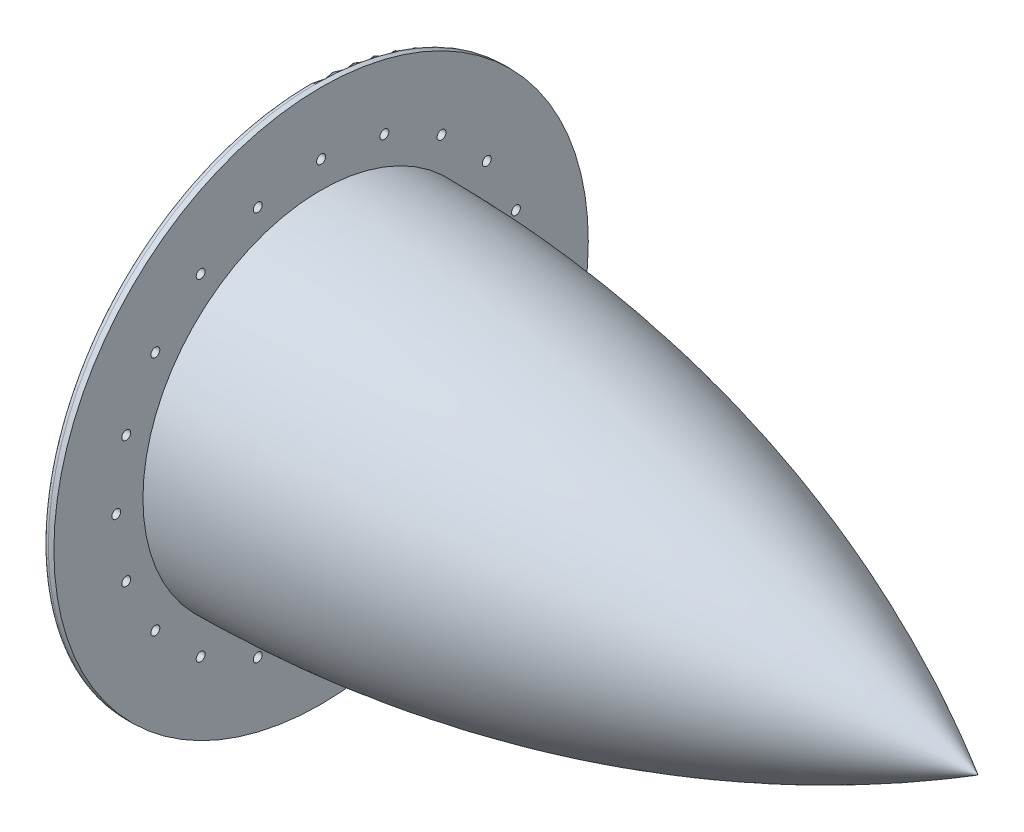
ISO-10303-21;
HEADER;
FILE_DESCRIPTION(('STEP AP214'),'2;1');
FILE_NAME('part.step','',(''),(''),'','','');
FILE_SCHEMA(('AUTOMOTIVE_DESIGN { 1 0 10303 214 1 1 1 1 }'));
ENDSEC;
DATA;
#1=APPLICATION_CONTEXT('core data for automotive mechanical design processes');
#2=APPLICATION_PROTOCOL_DEFINITION('international standard','automotive_design',2000,#1);
#3=PRODUCT_CONTEXT('',#1,'mechanical');
#4=PRODUCT('Part','Part','',(#3));
#5=PRODUCT_RELATED_PRODUCT_CATEGORY('part','',(#4));
#6=PRODUCT_DEFINITION_FORMATION('','',#4);
#7=PRODUCT_DEFINITION_CONTEXT('part definition',#1,'design');
#8=PRODUCT_DEFINITION('design','',#6,#7);
#9=PRODUCT_DEFINITION_SHAPE('','',#8);
#10=(LENGTH_UNIT() NAMED_UNIT(*) SI_UNIT(.MILLI.,.METRE.));
#11=(NAMED_UNIT(*) PLANE_ANGLE_UNIT() SI_UNIT($,.RADIAN.));
#12=(NAMED_UNIT(*) SI_UNIT($,.STERADIAN.) SOLID_ANGLE_UNIT());
#13=UNCERTAINTY_MEASURE_WITH_UNIT(LENGTH_MEASURE(1.E-05),#10,'distance_accuracy_value','');
#14=(GEOMETRIC_REPRESENTATION_CONTEXT(3) GLOBAL_UNCERTAINTY_ASSIGNED_CONTEXT((#13)) GLOBAL_UNIT_ASSIGNED_CONTEXT((#10,
#11,#12)) REPRESENTATION_CONTEXT('',''));
#15=CARTESIAN_POINT('',(0.,0.,0.));
#16=DIRECTION('',(0.,0.,1.));
#17=DIRECTION('',(1.,0.,0.));
#18=AXIS2_PLACEMENT_3D('',#15,#16,#17);
#19=CARTESIAN_POINT('',(-105.546398013908,0.,-513.894715566413));
#20=DIRECTION('',(0.,-1.,0.));
#21=DIRECTION('',(0.,0.,1.));
#22=AXIS2_PLACEMENT_3D('',#19,#20,#21);
#23=CIRCLE('',#22,593.899148863612);
#24=TRIMMED_CURVE('',#23,(PARAMETER_VALUE(-0.525068652014968)),
(PARAMETER_VALUE(0.525068652014968)),.T.,.PARAMETER.);
#25=CARTESIAN_POINT('',(-105.546398013908,0.,0.));
#26=DIRECTION('',(-1.,0.,0.));
#27=AXIS1_PLACEMENT('',#25,#26);
#28=SURFACE_OF_REVOLUTION('',#24,#27);
#29=CARTESIAN_POINT('',(192.158859470469,0.,0.));
#30=VERTEX_POINT('',#29);
#31=VERTEX_LOOP('',#30);
#32=FACE_BOUND('',#31,.T.);
#33=CARTESIAN_POINT('',(-102.841140529532,0.,0.));
#34=DIRECTION('',(-1.,0.,0.));
#35=DIRECTION('',(0.,0.,1.));
#36=AXIS2_PLACEMENT_3D('',#33,#34,#35);
#37=CIRCLE('',#36,79.9982719345903);
#38=CARTESIAN_POINT('',(-102.841140529532,0.,79.9982719345903));
#39=VERTEX_POINT('',#38);
#40=EDGE_CURVE('E67',#39,#39,#37,.T.);
#41=ORIENTED_EDGE('',*,*,#40,.F.);
#42=EDGE_LOOP('',(#41));
#43=FACE_BOUND('',#42,.T.);
#44=ADVANCED_FACE('F39',(#32,#43),#28,.T.);
#45=CARTESIAN_POINT('',(-102.841140529532,0.,0.));
#46=DIRECTION('',(-1.,0.,0.));
#47=DIRECTION('',(0.,0.,1.));
#48=AXIS2_PLACEMENT_3D('',#45,#46,#47);
#49=CYLINDRICAL_SURFACE('',#48,120.);
#50=CARTESIAN_POINT('',(-105.341140529532,0.,0.));
#51=DIRECTION('',(1.,0.,0.));
#52=DIRECTION('',(0.,0.,-1.));
#53=AXIS2_PLACEMENT_3D('',#50,#51,#52);
#54=CIRCLE('',#53,120.);
#55=CARTESIAN_POINT('',(-105.341140529532,0.,-120.));
#56=VERTEX_POINT('',#55);
#57=EDGE_CURVE('E11',#56,#56,#54,.T.);
#58=ORIENTED_EDGE('',*,*,#57,.T.);
#59=EDGE_LOOP('',(#58));
#60=FACE_BOUND('',#59,.T.);
#61=CARTESIAN_POINT('',(-102.841140529532,0.,0.));
#62=DIRECTION('',(-1.,0.,0.));
#63=DIRECTION('',(0.,0.,1.));
#64=AXIS2_PLACEMENT_3D('',#61,#62,#63);
#65=CIRCLE('',#64,120.);
#66=CARTESIAN_POINT('',(-102.841140529532,0.,120.));
#67=VERTEX_POINT('',#66);
#68=EDGE_CURVE('E64',#67,#67,#65,.T.);
#69=ORIENTED_EDGE('',*,*,#68,.T.);
#70=EDGE_LOOP('',(#69));
#71=FACE_BOUND('',#70,.T.);
#72=ADVANCED_FACE('F91',(#60,#71),#49,.T.);
#73=CARTESIAN_POINT('',(-102.841140529532,0.,0.));
#74=DIRECTION('',(-1.,0.,0.));
#75=DIRECTION('',(0.,0.,1.));
#76=AXIS2_PLACEMENT_3D('',#73,#74,#75);
#77=PLANE('',#76);
#78=CARTESIAN_POINT('',(-102.841140529532,92.,0.));
#79=DIRECTION('',(-1.,0.,0.));
#80=DIRECTION('',(0.,0.,1.));
#81=AXIS2_PLACEMENT_3D('',#78,#79,#80);
#82=CIRCLE('',#81,2.);
#83=CARTESIAN_POINT('',(-102.841140529532,92.,2.));
#84=VERTEX_POINT('',#83);
#85=EDGE_CURVE('E70',#84,#84,#82,.T.);
#86=ORIENTED_EDGE('',*,*,#85,.T.);
#87=EDGE_LOOP('',(#86));
#88=FACE_BOUND('',#87,.T.);
#89=CARTESIAN_POINT('',(-102.841140529532,87.4971994991545,-28.429563482494));
#90=DIRECTION('',(-1.,0.,0.));
#91=DIRECTION('',(0.,0.,1.));
#92=AXIS2_PLACEMENT_3D('',#89,#90,#91);
#93=CIRCLE('',#92,2.);
#94=CARTESIAN_POINT('',(-102.841140529532,87.4971994991545,-26.429563482494));
#95=VERTEX_POINT('',#94);
#96=EDGE_CURVE('E207',#95,#95,#93,.T.);
#97=ORIENTED_EDGE('',*,*,#96,.T.);
#98=EDGE_LOOP('',(#97));
#99=FACE_BOUND('',#98,.T.);
#100=CARTESIAN_POINT('',(-102.841140529532,74.4295634824929,-54.0762432109068));
#101=DIRECTION('',(-1.,0.,0.));
#102=DIRECTION('',(0.,0.,1.));
#103=AXIS2_PLACEMENT_3D('',#100,#101,#102);
#104=CIRCLE('',#103,2.00000000000254);
#105=CARTESIAN_POINT('',(-102.841140529532,74.4295634824929,-52.0762432109043));
#106=VERTEX_POINT('',#105);
#107=EDGE_CURVE('E196',#106,#106,#104,.T.);
#108=ORIENTED_EDGE('',*,*,#107,.T.);
#109=EDGE_LOOP('',(#108));
#110=FACE_BOUND('',#109,.T.);
#111=CARTESIAN_POINT('',(-102.841140529532,54.0762432109044,-74.4295634824936));
#112=DIRECTION('',(-1.,0.,0.));
#113=DIRECTION('',(0.,0.,1.));
#114=AXIS2_PLACEMENT_3D('',#111,#112,#113);
#115=CIRCLE('',#114,2.00000000000355);
#116=CARTESIAN_POINT('',(-102.841140529532,54.0762432109044,-72.42956348249));
#117=VERTEX_POINT('',#116);
#118=EDGE_CURVE('E191',#117,#117,#115,.T.);
#119=ORIENTED_EDGE('',*,*,#118,.T.);
#120=EDGE_LOOP('',(#119));
#121=FACE_BOUND('',#120,.T.);
#122=CARTESIAN_POINT('',(-102.841140529532,87.4971994991541,28.4295634824952));
#123=DIRECTION('',(-1.,0.,0.));
#124=DIRECTION('',(0.,0.,1.));
#125=AXIS2_PLACEMENT_3D('',#122,#123,#124);
#126=CIRCLE('',#125,2.);
#127=CARTESIAN_POINT('',(-102.841140529532,87.4971994991541,30.4295634824952));
#128=VERTEX_POINT('',#127);
#129=EDGE_CURVE('E261',#128,#128,#126,.T.);
#130=ORIENTED_EDGE('',*,*,#129,.T.);
#131=EDGE_LOOP('',(#130));
#132=FACE_BOUND('',#131,.T.);
#133=CARTESIAN_POINT('',(-102.841140529532,74.4295634824974,54.0762432109083));
#134=DIRECTION('',(-1.,0.,0.));
#135=DIRECTION('',(0.,0.,1.));
#136=AXIS2_PLACEMENT_3D('',#133,#134,#135);
#137=CIRCLE('',#136,2.00000000000017);
#138=CARTESIAN_POINT('',(-102.841140529532,74.4295634824974,56.0762432109084));
#139=VERTEX_POINT('',#138);
#140=EDGE_CURVE('E268',#139,#139,#137,.T.);
#141=ORIENTED_EDGE('',*,*,#140,.T.);
#142=EDGE_LOOP('',(#141));
#143=FACE_BOUND('',#142,.T.);
#144=CARTESIAN_POINT('',(-102.841140529532,54.0762432109107,74.4295634824968));
#145=DIRECTION('',(-1.,0.,0.));
#146=DIRECTION('',(0.,0.,1.));
#147=AXIS2_PLACEMENT_3D('',#144,#145,#146);
#148=CIRCLE('',#147,2.00000000000081);
#149=CARTESIAN_POINT('',(-102.841140529532,54.0762432109107,76.4295634824976));
#150=VERTEX_POINT('',#149);
#151=EDGE_CURVE('E274',#150,#150,#148,.T.);
#152=ORIENTED_EDGE('',*,*,#151,.T.);
#153=EDGE_LOOP('',(#152));
#154=FACE_BOUND('',#153,.T.);
#155=CARTESIAN_POINT('',(-102.841140529532,28.4295634824989,87.4971994991568));
#156=DIRECTION('',(-1.,0.,0.));
#157=DIRECTION('',(0.,0.,1.));
#158=AXIS2_PLACEMENT_3D('',#155,#156,#157);
#159=CIRCLE('',#158,2.00000000000173);
#160=CARTESIAN_POINT('',(-102.841140529532,28.4295634824989,89.4971994991586));
#161=VERTEX_POINT('',#160);
#162=EDGE_CURVE('E280',#161,#161,#159,.T.);
#163=ORIENTED_EDGE('',*,*,#162,.T.);
#164=EDGE_LOOP('',(#163));
#165=FACE_BOUND('',#164,.T.);
#166=CARTESIAN_POINT('',(-102.841140529532,3.90529577556752E-12,92.0000000000039));
#167=DIRECTION('',(-1.,0.,0.));
#168=DIRECTION('',(0.,0.,1.));
#169=AXIS2_PLACEMENT_3D('',#166,#167,#168);
#170=CIRCLE('',#169,2.0000000000029);
#171=CARTESIAN_POINT('',(-102.841140529532,3.90529577556752E-12,94.0000000000068));
#172=VERTEX_POINT('',#171);
#173=EDGE_CURVE('E286',#172,#172,#170,.T.);
#174=ORIENTED_EDGE('',*,*,#173,.T.);
#175=EDGE_LOOP('',(#174));
#176=FACE_BOUND('',#175,.T.);
#177=CARTESIAN_POINT('',(-102.841140529532,-28.4295634824914,87.4971994991592));
#178=DIRECTION('',(-1.,0.,0.));
#179=DIRECTION('',(0.,0.,1.));
#180=AXIS2_PLACEMENT_3D('',#177,#178,#179);
#181=CIRCLE('',#180,2.00000000000419);
#182=CARTESIAN_POINT('',(-102.841140529532,-28.4295634824914,89.4971994991634));
#183=VERTEX_POINT('',#182);
#184=EDGE_CURVE('E292',#183,#183,#181,.T.);
#185=ORIENTED_EDGE('',*,*,#184,.T.);
#186=EDGE_LOOP('',(#185));
#187=FACE_BOUND('',#186,.T.);
#188=CARTESIAN_POINT('',(-102.841140529532,-54.0762432109044,74.4295634825014));
#189=DIRECTION('',(-1.,0.,0.));
#190=DIRECTION('',(0.,0.,1.));
#191=AXIS2_PLACEMENT_3D('',#188,#189,#190);
#192=CIRCLE('',#191,2.00000000000543);
#193=CARTESIAN_POINT('',(-102.841140529532,-54.0762432109044,76.4295634825068));
#194=VERTEX_POINT('',#193);
#195=EDGE_CURVE('E298',#194,#194,#192,.T.);
#196=ORIENTED_EDGE('',*,*,#195,.T.);
#197=EDGE_LOOP('',(#196));
#198=FACE_BOUND('',#197,.T.);
#199=CARTESIAN_POINT('',(-102.841140529532,-74.4295634824929,54.0762432109146));
#200=DIRECTION('',(-1.,0.,0.));
#201=DIRECTION('',(0.,0.,1.));
#202=AXIS2_PLACEMENT_3D('',#199,#200,#201);
#203=CIRCLE('',#202,2.00000000000657);
#204=CARTESIAN_POINT('',(-102.841140529532,-74.4295634824929,56.0762432109212));
#205=VERTEX_POINT('',#204);
#206=EDGE_CURVE('E304',#205,#205,#203,.T.);
#207=ORIENTED_EDGE('',*,*,#206,.T.);
#208=EDGE_LOOP('',(#207));
#209=FACE_BOUND('',#208,.T.);
#210=CARTESIAN_POINT('',(-102.841140529532,-87.4971994991529,28.4295634825028));
#211=DIRECTION('',(-1.,0.,0.));
#212=DIRECTION('',(0.,0.,1.));
#213=AXIS2_PLACEMENT_3D('',#210,#211,#212);
#214=CIRCLE('',#213,2.00000000000752);
#215=CARTESIAN_POINT('',(-102.841140529532,-87.4971994991529,30.4295634825103));
#216=VERTEX_POINT('',#215);
#217=EDGE_CURVE('E213',#216,#216,#214,.T.);
#218=ORIENTED_EDGE('',*,*,#217,.T.);
#219=EDGE_LOOP('',(#218));
#220=FACE_BOUND('',#219,.T.);
#221=CARTESIAN_POINT('',(-102.841140529532,-92.,7.81059155113504E-12));
#222=DIRECTION('',(-1.,0.,0.));
#223=DIRECTION('',(0.,0.,1.));
#224=AXIS2_PLACEMENT_3D('',#221,#222,#223);
#225=CIRCLE('',#224,2.00000000000808);
#226=CARTESIAN_POINT('',(-102.841140529532,-92.,2.0000000000159));
#227=VERTEX_POINT('',#226);
#228=EDGE_CURVE('E220',#227,#227,#225,.T.);
#229=ORIENTED_EDGE('',*,*,#228,.T.);
#230=EDGE_LOOP('',(#229));
#231=FACE_BOUND('',#230,.T.);
#232=CARTESIAN_POINT('',(-102.841140529532,-87.4971994991553,-28.4295634824875));
#233=DIRECTION('',(-1.,0.,0.));
#234=DIRECTION('',(0.,0.,1.));
#235=AXIS2_PLACEMENT_3D('',#232,#233,#234);
#236=CIRCLE('',#235,2.00000000000835);
#237=CARTESIAN_POINT('',(-102.841140529532,-87.4971994991553,-26.4295634824792));
#238=VERTEX_POINT('',#237);
#239=EDGE_CURVE('E226',#238,#238,#236,.T.);
#240=ORIENTED_EDGE('',*,*,#239,.T.);
#241=EDGE_LOOP('',(#240));
#242=FACE_BOUND('',#241,.T.);
#243=CARTESIAN_POINT('',(-102.841140529532,-74.4295634824975,-54.0762432109005));
#244=DIRECTION('',(-1.,0.,0.));
#245=DIRECTION('',(0.,0.,1.));
#246=AXIS2_PLACEMENT_3D('',#243,#244,#245);
#247=CIRCLE('',#246,2.00000000000819);
#248=CARTESIAN_POINT('',(-102.841140529532,-74.4295634824975,-52.0762432108923));
#249=VERTEX_POINT('',#248);
#250=EDGE_CURVE('E232',#249,#249,#247,.T.);
#251=ORIENTED_EDGE('',*,*,#250,.T.);
#252=EDGE_LOOP('',(#251));
#253=FACE_BOUND('',#252,.T.);
#254=CARTESIAN_POINT('',(-102.841140529532,-54.0762432109107,-74.429563482489));
#255=DIRECTION('',(-1.,0.,0.));
#256=DIRECTION('',(0.,0.,1.));
#257=AXIS2_PLACEMENT_3D('',#254,#255,#256);
#258=CIRCLE('',#257,2.0000000000077);
#259=CARTESIAN_POINT('',(-102.841140529532,-54.0762432109107,-72.4295634824813));
#260=VERTEX_POINT('',#259);
#261=EDGE_CURVE('E238',#260,#260,#258,.T.);
#262=ORIENTED_EDGE('',*,*,#261,.T.);
#263=EDGE_LOOP('',(#262));
#264=FACE_BOUND('',#263,.T.);
#265=CARTESIAN_POINT('',(-102.841140529532,-28.4295634824989,-87.497199499149));
#266=DIRECTION('',(-1.,0.,0.));
#267=DIRECTION('',(0.,0.,1.));
#268=AXIS2_PLACEMENT_3D('',#265,#266,#267);
#269=CIRCLE('',#268,2.00000000000682);
#270=CARTESIAN_POINT('',(-102.841140529532,-28.4295634824989,-85.4971994991422));
#271=VERTEX_POINT('',#270);
#272=EDGE_CURVE('E244',#271,#271,#269,.T.);
#273=ORIENTED_EDGE('',*,*,#272,.T.);
#274=EDGE_LOOP('',(#273));
#275=FACE_BOUND('',#274,.T.);
#276=CARTESIAN_POINT('',(-102.841140529532,-3.91656252611968E-12,-91.9999999999961));
#277=DIRECTION('',(-1.,0.,0.));
#278=DIRECTION('',(0.,0.,1.));
#279=AXIS2_PLACEMENT_3D('',#276,#277,#278);
#280=CIRCLE('',#279,2.00000000000581);
#281=CARTESIAN_POINT('',(-102.841140529532,-3.91656252611968E-12,-89.9999999999903));
#282=VERTEX_POINT('',#281);
#283=EDGE_CURVE('E250',#282,#282,#280,.T.);
#284=ORIENTED_EDGE('',*,*,#283,.T.);
#285=EDGE_LOOP('',(#284));
#286=FACE_BOUND('',#285,.T.);
#287=CARTESIAN_POINT('',(-102.841140529532,28.4295634824914,-87.4971994991514));
#288=DIRECTION('',(-1.,0.,0.));
#289=DIRECTION('',(0.,0.,1.));
#290=AXIS2_PLACEMENT_3D('',#287,#288,#289);
#291=CIRCLE('',#290,2.00000000000468);
#292=CARTESIAN_POINT('',(-102.841140529532,28.4295634824914,-85.4971994991468));
#293=VERTEX_POINT('',#292);
#294=EDGE_CURVE('E256',#293,#293,#291,.T.);
#295=ORIENTED_EDGE('',*,*,#294,.T.);
#296=EDGE_LOOP('',(#295));
#297=FACE_BOUND('',#296,.T.);
#298=ORIENTED_EDGE('',*,*,#40,.T.);
#299=EDGE_LOOP('',(#298));
#300=FACE_BOUND('',#299,.T.);
#301=ORIENTED_EDGE('',*,*,#68,.F.);
#302=EDGE_LOOP('',(#301));
#303=FACE_BOUND('',#302,.T.);
#304=ADVANCED_FACE('F96',(#88,#99,#110,#121,#132,#143,#154,#165,#176,#187,#198,#209,#220,#231,
#242,#253,#264,#275,#286,#297,#300,#303),#77,.F.);
#305=CARTESIAN_POINT('',(-107.841140529532,0.,0.));
#306=DIRECTION('',(1.,0.,0.));
#307=DIRECTION('',(0.,0.,-1.));
#308=AXIS2_PLACEMENT_3D('',#305,#306,#307);
#309=PLANE('',#308);
#310=CARTESIAN_POINT('',(-107.841140529532,0.,0.));
#311=DIRECTION('',(1.,0.,0.));
#312=DIRECTION('',(0.,0.,-1.));
#313=AXIS2_PLACEMENT_3D('',#310,#311,#312);
#314=CIRCLE('',#313,117.5);
#315=CARTESIAN_POINT('',(-107.841140529532,0.,-117.5));
#316=VERTEX_POINT('',#315);
#317=EDGE_CURVE('E47',#316,#316,#314,.F.);
#318=ORIENTED_EDGE('',*,*,#317,.T.);
#319=EDGE_LOOP('',(#318));
#320=FACE_BOUND('',#319,.T.);
#321=CARTESIAN_POINT('',(-107.841140529532,92.,0.));
#322=DIRECTION('',(-1.,0.,0.));
#323=DIRECTION('',(0.,0.,1.));
#324=AXIS2_PLACEMENT_3D('',#321,#322,#323);
#325=CIRCLE('',#324,2.);
#326=CARTESIAN_POINT('',(-107.841140529532,92.,2.));
#327=VERTEX_POINT('',#326);
#328=EDGE_CURVE('E264',#327,#327,#325,.T.);
#329=ORIENTED_EDGE('',*,*,#328,.F.);
#330=EDGE_LOOP('',(#329));
#331=FACE_BOUND('',#330,.T.);
#332=CARTESIAN_POINT('',(-107.841140529532,87.4971994991545,-28.429563482494));
#333=DIRECTION('',(-1.,0.,0.));
#334=DIRECTION('',(0.,0.,1.));
#335=AXIS2_PLACEMENT_3D('',#332,#333,#334);
#336=CIRCLE('',#335,2.);
#337=CARTESIAN_POINT('',(-107.841140529532,87.4971994991545,-26.429563482494));
#338=VERTEX_POINT('',#337);
#339=EDGE_CURVE('E210',#338,#338,#336,.T.);
#340=ORIENTED_EDGE('',*,*,#339,.F.);
#341=EDGE_LOOP('',(#340));
#342=FACE_BOUND('',#341,.T.);
#343=CARTESIAN_POINT('',(-107.841140529532,74.4295634824929,-54.0762432109068));
#344=DIRECTION('',(-1.,0.,0.));
#345=DIRECTION('',(0.,0.,1.));
#346=AXIS2_PLACEMENT_3D('',#343,#344,#345);
#347=CIRCLE('',#346,2.00000000000254);
#348=CARTESIAN_POINT('',(-107.841140529532,74.4295634824929,-52.0762432109043));
#349=VERTEX_POINT('',#348);
#350=EDGE_CURVE('E201',#349,#349,#347,.T.);
#351=ORIENTED_EDGE('',*,*,#350,.F.);
#352=EDGE_LOOP('',(#351));
#353=FACE_BOUND('',#352,.T.);
#354=CARTESIAN_POINT('',(-107.841140529532,54.0762432109044,-74.4295634824936));
#355=DIRECTION('',(-1.,0.,0.));
#356=DIRECTION('',(0.,0.,1.));
#357=AXIS2_PLACEMENT_3D('',#354,#355,#356);
#358=CIRCLE('',#357,2.00000000000355);
#359=CARTESIAN_POINT('',(-107.841140529532,54.0762432109044,-72.42956348249));
#360=VERTEX_POINT('',#359);
#361=EDGE_CURVE('E194',#360,#360,#358,.T.);
#362=ORIENTED_EDGE('',*,*,#361,.F.);
#363=EDGE_LOOP('',(#362));
#364=FACE_BOUND('',#363,.T.);
#365=CARTESIAN_POINT('',(-107.841140529532,87.4971994991541,28.4295634824952));
#366=DIRECTION('',(-1.,0.,0.));
#367=DIRECTION('',(0.,0.,1.));
#368=AXIS2_PLACEMENT_3D('',#365,#366,#367);
#369=CIRCLE('',#368,2.);
#370=CARTESIAN_POINT('',(-107.841140529532,87.4971994991541,30.4295634824952));
#371=VERTEX_POINT('',#370);
#372=EDGE_CURVE('E265',#371,#371,#369,.T.);
#373=ORIENTED_EDGE('',*,*,#372,.F.);
#374=EDGE_LOOP('',(#373));
#375=FACE_BOUND('',#374,.T.);
#376=CARTESIAN_POINT('',(-107.841140529532,74.4295634824974,54.0762432109083));
#377=DIRECTION('',(-1.,0.,0.));
#378=DIRECTION('',(0.,0.,1.));
#379=AXIS2_PLACEMENT_3D('',#376,#377,#378);
#380=CIRCLE('',#379,2.00000000000017);
#381=CARTESIAN_POINT('',(-107.841140529532,74.4295634824974,56.0762432109084));
#382=VERTEX_POINT('',#381);
#383=EDGE_CURVE('E271',#382,#382,#380,.T.);
#384=ORIENTED_EDGE('',*,*,#383,.F.);
#385=EDGE_LOOP('',(#384));
#386=FACE_BOUND('',#385,.T.);
#387=CARTESIAN_POINT('',(-107.841140529532,54.0762432109107,74.4295634824968));
#388=DIRECTION('',(-1.,0.,0.));
#389=DIRECTION('',(0.,0.,1.));
#390=AXIS2_PLACEMENT_3D('',#387,#388,#389);
#391=CIRCLE('',#390,2.00000000000081);
#392=CARTESIAN_POINT('',(-107.841140529532,54.0762432109107,76.4295634824976));
#393=VERTEX_POINT('',#392);
#394=EDGE_CURVE('E277',#393,#393,#391,.T.);
#395=ORIENTED_EDGE('',*,*,#394,.F.);
#396=EDGE_LOOP('',(#395));
#397=FACE_BOUND('',#396,.T.);
#398=CARTESIAN_POINT('',(-107.841140529532,28.4295634824989,87.4971994991568));
#399=DIRECTION('',(-1.,0.,0.));
#400=DIRECTION('',(0.,0.,1.));
#401=AXIS2_PLACEMENT_3D('',#398,#399,#400);
#402=CIRCLE('',#401,2.00000000000173);
#403=CARTESIAN_POINT('',(-107.841140529532,28.4295634824989,89.4971994991586));
#404=VERTEX_POINT('',#403);
#405=EDGE_CURVE('E283',#404,#404,#402,.T.);
#406=ORIENTED_EDGE('',*,*,#405,.F.);
#407=EDGE_LOOP('',(#406));
#408=FACE_BOUND('',#407,.T.);
#409=CARTESIAN_POINT('',(-107.841140529532,3.90529577556752E-12,92.0000000000039));
#410=DIRECTION('',(-1.,0.,0.));
#411=DIRECTION('',(0.,0.,1.));
#412=AXIS2_PLACEMENT_3D('',#409,#410,#411);
#413=CIRCLE('',#412,2.0000000000029);
#414=CARTESIAN_POINT('',(-107.841140529532,3.90529577556752E-12,94.0000000000068));
#415=VERTEX_POINT('',#414);
#416=EDGE_CURVE('E289',#415,#415,#413,.T.);
#417=ORIENTED_EDGE('',*,*,#416,.F.);
#418=EDGE_LOOP('',(#417));
#419=FACE_BOUND('',#418,.T.);
#420=CARTESIAN_POINT('',(-107.841140529532,-28.4295634824914,87.4971994991592));
#421=DIRECTION('',(-1.,0.,0.));
#422=DIRECTION('',(0.,0.,1.));
#423=AXIS2_PLACEMENT_3D('',#420,#421,#422);
#424=CIRCLE('',#423,2.00000000000419);
#425=CARTESIAN_POINT('',(-107.841140529532,-28.4295634824914,89.4971994991634));
#426=VERTEX_POINT('',#425);
#427=EDGE_CURVE('E295',#426,#426,#424,.T.);
#428=ORIENTED_EDGE('',*,*,#427,.F.);
#429=EDGE_LOOP('',(#428));
#430=FACE_BOUND('',#429,.T.);
#431=CARTESIAN_POINT('',(-107.841140529532,-54.0762432109044,74.4295634825014));
#432=DIRECTION('',(-1.,0.,0.));
#433=DIRECTION('',(0.,0.,1.));
#434=AXIS2_PLACEMENT_3D('',#431,#432,#433);
#435=CIRCLE('',#434,2.00000000000543);
#436=CARTESIAN_POINT('',(-107.841140529532,-54.0762432109044,76.4295634825068));
#437=VERTEX_POINT('',#436);
#438=EDGE_CURVE('E301',#437,#437,#435,.T.);
#439=ORIENTED_EDGE('',*,*,#438,.F.);
#440=EDGE_LOOP('',(#439));
#441=FACE_BOUND('',#440,.T.);
#442=CARTESIAN_POINT('',(-107.841140529532,-74.4295634824929,54.0762432109146));
#443=DIRECTION('',(-1.,0.,0.));
#444=DIRECTION('',(0.,0.,1.));
#445=AXIS2_PLACEMENT_3D('',#442,#443,#444);
#446=CIRCLE('',#445,2.00000000000657);
#447=CARTESIAN_POINT('',(-107.841140529532,-74.4295634824929,56.0762432109212));
#448=VERTEX_POINT('',#447);
#449=EDGE_CURVE('E216',#448,#448,#446,.T.);
#450=ORIENTED_EDGE('',*,*,#449,.F.);
#451=EDGE_LOOP('',(#450));
#452=FACE_BOUND('',#451,.T.);
#453=CARTESIAN_POINT('',(-107.841140529532,-87.4971994991529,28.4295634825028));
#454=DIRECTION('',(-1.,0.,0.));
#455=DIRECTION('',(0.,0.,1.));
#456=AXIS2_PLACEMENT_3D('',#453,#454,#455);
#457=CIRCLE('',#456,2.00000000000752);
#458=CARTESIAN_POINT('',(-107.841140529532,-87.4971994991529,30.4295634825103));
#459=VERTEX_POINT('',#458);
#460=EDGE_CURVE('E217',#459,#459,#457,.T.);
#461=ORIENTED_EDGE('',*,*,#460,.F.);
#462=EDGE_LOOP('',(#461));
#463=FACE_BOUND('',#462,.T.);
#464=CARTESIAN_POINT('',(-107.841140529532,-92.,7.81059155113504E-12));
#465=DIRECTION('',(-1.,0.,0.));
#466=DIRECTION('',(0.,0.,1.));
#467=AXIS2_PLACEMENT_3D('',#464,#465,#466);
#468=CIRCLE('',#467,2.00000000000808);
#469=CARTESIAN_POINT('',(-107.841140529532,-92.,2.0000000000159));
#470=VERTEX_POINT('',#469);
#471=EDGE_CURVE('E223',#470,#470,#468,.T.);
#472=ORIENTED_EDGE('',*,*,#471,.F.);
#473=EDGE_LOOP('',(#472));
#474=FACE_BOUND('',#473,.T.);
#475=CARTESIAN_POINT('',(-107.841140529532,-87.4971994991553,-28.4295634824875));
#476=DIRECTION('',(-1.,0.,0.));
#477=DIRECTION('',(0.,0.,1.));
#478=AXIS2_PLACEMENT_3D('',#475,#476,#477);
#479=CIRCLE('',#478,2.00000000000835);
#480=CARTESIAN_POINT('',(-107.841140529532,-87.4971994991553,-26.4295634824792));
#481=VERTEX_POINT('',#480);
#482=EDGE_CURVE('E229',#481,#481,#479,.T.);
#483=ORIENTED_EDGE('',*,*,#482,.F.);
#484=EDGE_LOOP('',(#483));
#485=FACE_BOUND('',#484,.T.);
#486=CARTESIAN_POINT('',(-107.841140529532,-74.4295634824975,-54.0762432109005));
#487=DIRECTION('',(-1.,0.,0.));
#488=DIRECTION('',(0.,0.,1.));
#489=AXIS2_PLACEMENT_3D('',#486,#487,#488);
#490=CIRCLE('',#489,2.00000000000819);
#491=CARTESIAN_POINT('',(-107.841140529532,-74.4295634824975,-52.0762432108923));
#492=VERTEX_POINT('',#491);
#493=EDGE_CURVE('E235',#492,#492,#490,.T.);
#494=ORIENTED_EDGE('',*,*,#493,.F.);
#495=EDGE_LOOP('',(#494));
#496=FACE_BOUND('',#495,.T.);
#497=CARTESIAN_POINT('',(-107.841140529532,-54.0762432109107,-74.429563482489));
#498=DIRECTION('',(-1.,0.,0.));
#499=DIRECTION('',(0.,0.,1.));
#500=AXIS2_PLACEMENT_3D('',#497,#498,#499);
#501=CIRCLE('',#500,2.0000000000077);
#502=CARTESIAN_POINT('',(-107.841140529532,-54.0762432109107,-72.4295634824813));
#503=VERTEX_POINT('',#502);
#504=EDGE_CURVE('E241',#503,#503,#501,.T.);
#505=ORIENTED_EDGE('',*,*,#504,.F.);
#506=EDGE_LOOP('',(#505));
#507=FACE_BOUND('',#506,.T.);
#508=CARTESIAN_POINT('',(-107.841140529532,-28.4295634824989,-87.497199499149));
#509=DIRECTION('',(-1.,0.,0.));
#510=DIRECTION('',(0.,0.,1.));
#511=AXIS2_PLACEMENT_3D('',#508,#509,#510);
#512=CIRCLE('',#511,2.00000000000682);
#513=CARTESIAN_POINT('',(-107.841140529532,-28.4295634824989,-85.4971994991422));
#514=VERTEX_POINT('',#513);
#515=EDGE_CURVE('E247',#514,#514,#512,.T.);
#516=ORIENTED_EDGE('',*,*,#515,.F.);
#517=EDGE_LOOP('',(#516));
#518=FACE_BOUND('',#517,.T.);
#519=CARTESIAN_POINT('',(-107.841140529532,-3.91656252611968E-12,-91.9999999999961));
#520=DIRECTION('',(-1.,0.,0.));
#521=DIRECTION('',(0.,0.,1.));
#522=AXIS2_PLACEMENT_3D('',#519,#520,#521);
#523=CIRCLE('',#522,2.00000000000581);
#524=CARTESIAN_POINT('',(-107.841140529532,-3.91656252611968E-12,-89.9999999999903));
#525=VERTEX_POINT('',#524);
#526=EDGE_CURVE('E253',#525,#525,#523,.T.);
#527=ORIENTED_EDGE('',*,*,#526,.F.);
#528=EDGE_LOOP('',(#527));
#529=FACE_BOUND('',#528,.T.);
#530=CARTESIAN_POINT('',(-107.841140529532,28.4295634824914,-87.4971994991514));
#531=DIRECTION('',(-1.,0.,0.));
#532=DIRECTION('',(0.,0.,1.));
#533=AXIS2_PLACEMENT_3D('',#530,#531,#532);
#534=CIRCLE('',#533,2.00000000000468);
#535=CARTESIAN_POINT('',(-107.841140529532,28.4295634824914,-85.4971994991468));
#536=VERTEX_POINT('',#535);
#537=EDGE_CURVE('E198',#536,#536,#534,.T.);
#538=ORIENTED_EDGE('',*,*,#537,.F.);
#539=EDGE_LOOP('',(#538));
#540=FACE_BOUND('',#539,.T.);
#541=CARTESIAN_POINT('',(-107.841140529532,0.,0.));
#542=DIRECTION('',(1.,0.,0.));
#543=DIRECTION('',(0.,0.,-1.));
#544=AXIS2_PLACEMENT_3D('',#541,#542,#543);
#545=CIRCLE('',#544,69.9999240736837);
#546=CARTESIAN_POINT('',(-107.841140529532,0.,-69.9999240736837));
#547=VERTEX_POINT('',#546);
#548=EDGE_CURVE('E63',#547,#547,#545,.F.);
#549=ORIENTED_EDGE('',*,*,#548,.F.);
#550=EDGE_LOOP('',(#549));
#551=FACE_BOUND('',#550,.T.);
#552=ADVANCED_FACE('F77',(#320,#331,#342,#353,#364,#375,#386,#397,#408,#419,#430,#441,#452,#463,
#474,#485,#496,#507,#518,#529,#540,#551),#309,.F.);
#553=CARTESIAN_POINT('',(-102.841140529532,0.,0.));
#554=DIRECTION('',(-1.,0.,0.));
#555=DIRECTION('',(0.,0.,1.));
#556=AXIS2_PLACEMENT_3D('',#553,#554,#555);
#557=CYLINDRICAL_SURFACE('',#556,69.9999240736837);
#558=CARTESIAN_POINT('',(-103.251655498292,0.,0.));
#559=DIRECTION('',(-1.,0.,0.));
#560=DIRECTION('',(0.,0.,1.));
#561=AXIS2_PLACEMENT_3D('',#558,#559,#560);
#562=CIRCLE('',#561,69.9999240736837);
#563=CARTESIAN_POINT('',(-103.251655498292,0.,69.9999240736837));
#564=VERTEX_POINT('',#563);
#565=EDGE_CURVE('E61',#564,#564,#562,.T.);
#566=ORIENTED_EDGE('',*,*,#565,.F.);
#567=EDGE_LOOP('',(#566));
#568=FACE_BOUND('',#567,.T.);
#569=ORIENTED_EDGE('',*,*,#548,.T.);
#570=EDGE_LOOP('',(#569));
#571=FACE_BOUND('',#570,.T.);
#572=ADVANCED_FACE('F57',(#568,#571),#557,.F.);
#573=CARTESIAN_POINT('',(-105.546398013908,0.,-513.894715566413));
#574=DIRECTION('',(0.,-1.,0.));
#575=DIRECTION('',(0.,0.,1.));
#576=AXIS2_PLACEMENT_3D('',#573,#574,#575);
#577=CIRCLE('',#576,583.899148863612);
#578=TRIMMED_CURVE('',#577,(PARAMETER_VALUE(-0.49470524202975)),
(PARAMETER_VALUE(0.49470524202975)),.T.,.PARAMETER.);
#579=CARTESIAN_POINT('',(-105.546398013908,0.,0.));
#580=DIRECTION('',(-1.,0.,0.));
#581=AXIS1_PLACEMENT('',#579,#580);
#582=SURFACE_OF_REVOLUTION('',#578,#581);
#583=CARTESIAN_POINT('',(171.672716328099,0.,0.));
#584=VERTEX_POINT('',#583);
#585=VERTEX_LOOP('',#584);
#586=FACE_BOUND('',#585,.T.);
#587=ORIENTED_EDGE('',*,*,#565,.T.);
#588=EDGE_LOOP('',(#587));
#589=FACE_BOUND('',#588,.T.);
#590=ADVANCED_FACE('F53',(#586,#589),#582,.F.);
#591=CARTESIAN_POINT('',(-102.841140529532,28.4295634824914,-87.4971994991514));
#592=DIRECTION('',(-1.,0.,0.));
#593=DIRECTION('',(0.,0.,1.));
#594=AXIS2_PLACEMENT_3D('',#591,#592,#593);
#595=CYLINDRICAL_SURFACE('',#594,2.00000000000468);
#596=ORIENTED_EDGE('',*,*,#294,.F.);
#597=EDGE_LOOP('',(#596));
#598=FACE_BOUND('',#597,.T.);
#599=ORIENTED_EDGE('',*,*,#537,.T.);
#600=EDGE_LOOP('',(#599));
#601=FACE_BOUND('',#600,.T.);
#602=ADVANCED_FACE('F56',(#598,#601),#595,.F.);
#603=CARTESIAN_POINT('',(-102.841140529532,-3.91656252611968E-12,-91.9999999999961));
#604=DIRECTION('',(-1.,0.,0.));
#605=DIRECTION('',(0.,0.,1.));
#606=AXIS2_PLACEMENT_3D('',#603,#604,#605);
#607=CYLINDRICAL_SURFACE('',#606,2.00000000000581);
#608=ORIENTED_EDGE('',*,*,#283,.F.);
#609=EDGE_LOOP('',(#608));
#610=FACE_BOUND('',#609,.T.);
#611=ORIENTED_EDGE('',*,*,#526,.T.);
#612=EDGE_LOOP('',(#611));
#613=FACE_BOUND('',#612,.T.);
#614=ADVANCED_FACE('F149',(#610,#613),#607,.F.);
#615=CARTESIAN_POINT('',(-102.841140529532,-28.4295634824989,-87.497199499149));
#616=DIRECTION('',(-1.,0.,0.));
#617=DIRECTION('',(0.,0.,1.));
#618=AXIS2_PLACEMENT_3D('',#615,#616,#617);
#619=CYLINDRICAL_SURFACE('',#618,2.00000000000682);
#620=ORIENTED_EDGE('',*,*,#272,.F.);
#621=EDGE_LOOP('',(#620));
#622=FACE_BOUND('',#621,.T.);
#623=ORIENTED_EDGE('',*,*,#515,.T.);
#624=EDGE_LOOP('',(#623));
#625=FACE_BOUND('',#624,.T.);
#626=ADVANCED_FACE('F153',(#622,#625),#619,.F.);
#627=CARTESIAN_POINT('',(-102.841140529532,-54.0762432109107,-74.429563482489));
#628=DIRECTION('',(-1.,0.,0.));
#629=DIRECTION('',(0.,0.,1.));
#630=AXIS2_PLACEMENT_3D('',#627,#628,#629);
#631=CYLINDRICAL_SURFACE('',#630,2.0000000000077);
#632=ORIENTED_EDGE('',*,*,#261,.F.);
#633=EDGE_LOOP('',(#632));
#634=FACE_BOUND('',#633,.T.);
#635=ORIENTED_EDGE('',*,*,#504,.T.);
#636=EDGE_LOOP('',(#635));
#637=FACE_BOUND('',#636,.T.);
#638=ADVANCED_FACE('F157',(#634,#637),#631,.F.);
#639=CARTESIAN_POINT('',(-102.841140529532,-74.4295634824975,-54.0762432109005));
#640=DIRECTION('',(-1.,0.,0.));
#641=DIRECTION('',(0.,0.,1.));
#642=AXIS2_PLACEMENT_3D('',#639,#640,#641);
#643=CYLINDRICAL_SURFACE('',#642,2.00000000000819);
#644=ORIENTED_EDGE('',*,*,#250,.F.);
#645=EDGE_LOOP('',(#644));
#646=FACE_BOUND('',#645,.T.);
#647=ORIENTED_EDGE('',*,*,#493,.T.);
#648=EDGE_LOOP('',(#647));
#649=FACE_BOUND('',#648,.T.);
#650=ADVANCED_FACE('F161',(#646,#649),#643,.F.);
#651=CARTESIAN_POINT('',(-102.841140529532,-87.4971994991553,-28.4295634824875));
#652=DIRECTION('',(-1.,0.,0.));
#653=DIRECTION('',(0.,0.,1.));
#654=AXIS2_PLACEMENT_3D('',#651,#652,#653);
#655=CYLINDRICAL_SURFACE('',#654,2.00000000000835);
#656=ORIENTED_EDGE('',*,*,#239,.F.);
#657=EDGE_LOOP('',(#656));
#658=FACE_BOUND('',#657,.T.);
#659=ORIENTED_EDGE('',*,*,#482,.T.);
#660=EDGE_LOOP('',(#659));
#661=FACE_BOUND('',#660,.T.);
#662=ADVANCED_FACE('F165',(#658,#661),#655,.F.);
#663=CARTESIAN_POINT('',(-102.841140529532,-92.,7.81059155113504E-12));
#664=DIRECTION('',(-1.,0.,0.));
#665=DIRECTION('',(0.,0.,1.));
#666=AXIS2_PLACEMENT_3D('',#663,#664,#665);
#667=CYLINDRICAL_SURFACE('',#666,2.00000000000808);
#668=ORIENTED_EDGE('',*,*,#228,.F.);
#669=EDGE_LOOP('',(#668));
#670=FACE_BOUND('',#669,.T.);
#671=ORIENTED_EDGE('',*,*,#471,.T.);
#672=EDGE_LOOP('',(#671));
#673=FACE_BOUND('',#672,.T.);
#674=ADVANCED_FACE('F169',(#670,#673),#667,.F.);
#675=CARTESIAN_POINT('',(-102.841140529532,-87.4971994991529,28.4295634825028));
#676=DIRECTION('',(-1.,0.,0.));
#677=DIRECTION('',(0.,0.,1.));
#678=AXIS2_PLACEMENT_3D('',#675,#676,#677);
#679=CYLINDRICAL_SURFACE('',#678,2.00000000000752);
#680=ORIENTED_EDGE('',*,*,#217,.F.);
#681=EDGE_LOOP('',(#680));
#682=FACE_BOUND('',#681,.T.);
#683=ORIENTED_EDGE('',*,*,#460,.T.);
#684=EDGE_LOOP('',(#683));
#685=FACE_BOUND('',#684,.T.);
#686=ADVANCED_FACE('F117',(#682,#685),#679,.F.);
#687=CARTESIAN_POINT('',(-102.841140529532,-74.4295634824929,54.0762432109146));
#688=DIRECTION('',(-1.,0.,0.));
#689=DIRECTION('',(0.,0.,1.));
#690=AXIS2_PLACEMENT_3D('',#687,#688,#689);
#691=CYLINDRICAL_SURFACE('',#690,2.00000000000657);
#692=ORIENTED_EDGE('',*,*,#206,.F.);
#693=EDGE_LOOP('',(#692));
#694=FACE_BOUND('',#693,.T.);
#695=ORIENTED_EDGE('',*,*,#449,.T.);
#696=EDGE_LOOP('',(#695));
#697=FACE_BOUND('',#696,.T.);
#698=ADVANCED_FACE('F113',(#694,#697),#691,.F.);
#699=CARTESIAN_POINT('',(-102.841140529532,-54.0762432109044,74.4295634825014));
#700=DIRECTION('',(-1.,0.,0.));
#701=DIRECTION('',(0.,0.,1.));
#702=AXIS2_PLACEMENT_3D('',#699,#700,#701);
#703=CYLINDRICAL_SURFACE('',#702,2.00000000000543);
#704=ORIENTED_EDGE('',*,*,#195,.F.);
#705=EDGE_LOOP('',(#704));
#706=FACE_BOUND('',#705,.T.);
#707=ORIENTED_EDGE('',*,*,#438,.T.);
#708=EDGE_LOOP('',(#707));
#709=FACE_BOUND('',#708,.T.);
#710=ADVANCED_FACE('F116',(#706,#709),#703,.F.);
#711=CARTESIAN_POINT('',(-102.841140529532,-28.4295634824914,87.4971994991592));
#712=DIRECTION('',(-1.,0.,0.));
#713=DIRECTION('',(0.,0.,1.));
#714=AXIS2_PLACEMENT_3D('',#711,#712,#713);
#715=CYLINDRICAL_SURFACE('',#714,2.00000000000419);
#716=ORIENTED_EDGE('',*,*,#184,.F.);
#717=EDGE_LOOP('',(#716));
#718=FACE_BOUND('',#717,.T.);
#719=ORIENTED_EDGE('',*,*,#427,.T.);
#720=EDGE_LOOP('',(#719));
#721=FACE_BOUND('',#720,.T.);
#722=ADVANCED_FACE('F121',(#718,#721),#715,.F.);
#723=CARTESIAN_POINT('',(-102.841140529532,3.90529577556752E-12,92.0000000000039));
#724=DIRECTION('',(-1.,0.,0.));
#725=DIRECTION('',(0.,0.,1.));
#726=AXIS2_PLACEMENT_3D('',#723,#724,#725);
#727=CYLINDRICAL_SURFACE('',#726,2.0000000000029);
#728=ORIENTED_EDGE('',*,*,#173,.F.);
#729=EDGE_LOOP('',(#728));
#730=FACE_BOUND('',#729,.T.);
#731=ORIENTED_EDGE('',*,*,#416,.T.);
#732=EDGE_LOOP('',(#731));
#733=FACE_BOUND('',#732,.T.);
#734=ADVANCED_FACE('F125',(#730,#733),#727,.F.);
#735=CARTESIAN_POINT('',(-102.841140529532,28.4295634824989,87.4971994991568));
#736=DIRECTION('',(-1.,0.,0.));
#737=DIRECTION('',(0.,0.,1.));
#738=AXIS2_PLACEMENT_3D('',#735,#736,#737);
#739=CYLINDRICAL_SURFACE('',#738,2.00000000000173);
#740=ORIENTED_EDGE('',*,*,#162,.F.);
#741=EDGE_LOOP('',(#740));
#742=FACE_BOUND('',#741,.T.);
#743=ORIENTED_EDGE('',*,*,#405,.T.);
#744=EDGE_LOOP('',(#743));
#745=FACE_BOUND('',#744,.T.);
#746=ADVANCED_FACE('F129',(#742,#745),#739,.F.);
#747=CARTESIAN_POINT('',(-102.841140529532,54.0762432109107,74.4295634824968));
#748=DIRECTION('',(-1.,0.,0.));
#749=DIRECTION('',(0.,0.,1.));
#750=AXIS2_PLACEMENT_3D('',#747,#748,#749);
#751=CYLINDRICAL_SURFACE('',#750,2.00000000000081);
#752=ORIENTED_EDGE('',*,*,#151,.F.);
#753=EDGE_LOOP('',(#752));
#754=FACE_BOUND('',#753,.T.);
#755=ORIENTED_EDGE('',*,*,#394,.T.);
#756=EDGE_LOOP('',(#755));
#757=FACE_BOUND('',#756,.T.);
#758=ADVANCED_FACE('F133',(#754,#757),#751,.F.);
#759=CARTESIAN_POINT('',(-102.841140529532,74.4295634824974,54.0762432109083));
#760=DIRECTION('',(-1.,0.,0.));
#761=DIRECTION('',(0.,0.,1.));
#762=AXIS2_PLACEMENT_3D('',#759,#760,#761);
#763=CYLINDRICAL_SURFACE('',#762,2.00000000000017);
#764=ORIENTED_EDGE('',*,*,#140,.F.);
#765=EDGE_LOOP('',(#764));
#766=FACE_BOUND('',#765,.T.);
#767=ORIENTED_EDGE('',*,*,#383,.T.);
#768=EDGE_LOOP('',(#767));
#769=FACE_BOUND('',#768,.T.);
#770=ADVANCED_FACE('F137',(#766,#769),#763,.F.);
#771=CARTESIAN_POINT('',(-102.841140529532,87.4971994991541,28.4295634824952));
#772=DIRECTION('',(-1.,0.,0.));
#773=DIRECTION('',(0.,0.,1.));
#774=AXIS2_PLACEMENT_3D('',#771,#772,#773);
#775=CYLINDRICAL_SURFACE('',#774,2.);
#776=ORIENTED_EDGE('',*,*,#129,.F.);
#777=EDGE_LOOP('',(#776));
#778=FACE_BOUND('',#777,.T.);
#779=ORIENTED_EDGE('',*,*,#372,.T.);
#780=EDGE_LOOP('',(#779));
#781=FACE_BOUND('',#780,.T.);
#782=ADVANCED_FACE('F141',(#778,#781),#775,.F.);
#783=CARTESIAN_POINT('',(-102.841140529532,54.0762432109044,-74.4295634824936));
#784=DIRECTION('',(-1.,0.,0.));
#785=DIRECTION('',(0.,0.,1.));
#786=AXIS2_PLACEMENT_3D('',#783,#784,#785);
#787=CYLINDRICAL_SURFACE('',#786,2.00000000000355);
#788=ORIENTED_EDGE('',*,*,#118,.F.);
#789=EDGE_LOOP('',(#788));
#790=FACE_BOUND('',#789,.T.);
#791=ORIENTED_EDGE('',*,*,#361,.T.);
#792=EDGE_LOOP('',(#791));
#793=FACE_BOUND('',#792,.T.);
#794=ADVANCED_FACE('F145',(#790,#793),#787,.F.);
#795=CARTESIAN_POINT('',(-102.841140529532,74.4295634824929,-54.0762432109068));
#796=DIRECTION('',(-1.,0.,0.));
#797=DIRECTION('',(0.,0.,1.));
#798=AXIS2_PLACEMENT_3D('',#795,#796,#797);
#799=CYLINDRICAL_SURFACE('',#798,2.00000000000254);
#800=ORIENTED_EDGE('',*,*,#107,.F.);
#801=EDGE_LOOP('',(#800));
#802=FACE_BOUND('',#801,.T.);
#803=ORIENTED_EDGE('',*,*,#350,.T.);
#804=EDGE_LOOP('',(#803));
#805=FACE_BOUND('',#804,.T.);
#806=ADVANCED_FACE('F179',(#802,#805),#799,.F.);
#807=CARTESIAN_POINT('',(-102.841140529532,87.4971994991545,-28.429563482494));
#808=DIRECTION('',(-1.,0.,0.));
#809=DIRECTION('',(0.,0.,1.));
#810=AXIS2_PLACEMENT_3D('',#807,#808,#809);
#811=CYLINDRICAL_SURFACE('',#810,2.);
#812=ORIENTED_EDGE('',*,*,#96,.F.);
#813=EDGE_LOOP('',(#812));
#814=FACE_BOUND('',#813,.T.);
#815=ORIENTED_EDGE('',*,*,#339,.T.);
#816=EDGE_LOOP('',(#815));
#817=FACE_BOUND('',#816,.T.);
#818=ADVANCED_FACE('F86',(#814,#817),#811,.F.);
#819=CARTESIAN_POINT('',(-102.841140529532,92.,0.));
#820=DIRECTION('',(-1.,0.,0.));
#821=DIRECTION('',(0.,0.,1.));
#822=AXIS2_PLACEMENT_3D('',#819,#820,#821);
#823=CYLINDRICAL_SURFACE('',#822,2.);
#824=ORIENTED_EDGE('',*,*,#85,.F.);
#825=EDGE_LOOP('',(#824));
#826=FACE_BOUND('',#825,.T.);
#827=ORIENTED_EDGE('',*,*,#328,.T.);
#828=EDGE_LOOP('',(#827));
#829=FACE_BOUND('',#828,.T.);
#830=ADVANCED_FACE('F81',(#826,#829),#823,.F.);
#831=CARTESIAN_POINT('',(-105.341140529532,0.,0.));
#832=DIRECTION('',(1.,0.,0.));
#833=DIRECTION('',(0.,0.,-1.));
#834=AXIS2_PLACEMENT_3D('',#831,#832,#833);
#835=TOROIDAL_SURFACE('',#834,117.5,2.5);
#836=ORIENTED_EDGE('',*,*,#57,.F.);
#837=EDGE_LOOP('',(#836));
#838=FACE_BOUND('',#837,.T.);
#839=ORIENTED_EDGE('',*,*,#317,.F.);
#840=EDGE_LOOP('',(#839));
#841=FACE_BOUND('',#840,.T.);
#842=ADVANCED_FACE('F41',(#838,#841),#835,.T.);
#843=CLOSED_SHELL('',(#44,#72,#304,#552,#572,#590,#602,#614,#626,#638,#650,#662,#674,#686,#698,
#710,#722,#734,#746,#758,#770,#782,#794,#806,#818,#830,#842));
#844=MANIFOLD_SOLID_BREP('B2',#843);
#845=ADVANCED_BREP_SHAPE_REPRESENTATION('',(#18,#844),#14);
#846=SHAPE_DEFINITION_REPRESENTATION(#9,#845);
ENDSEC;
END-ISO-10303-21;
